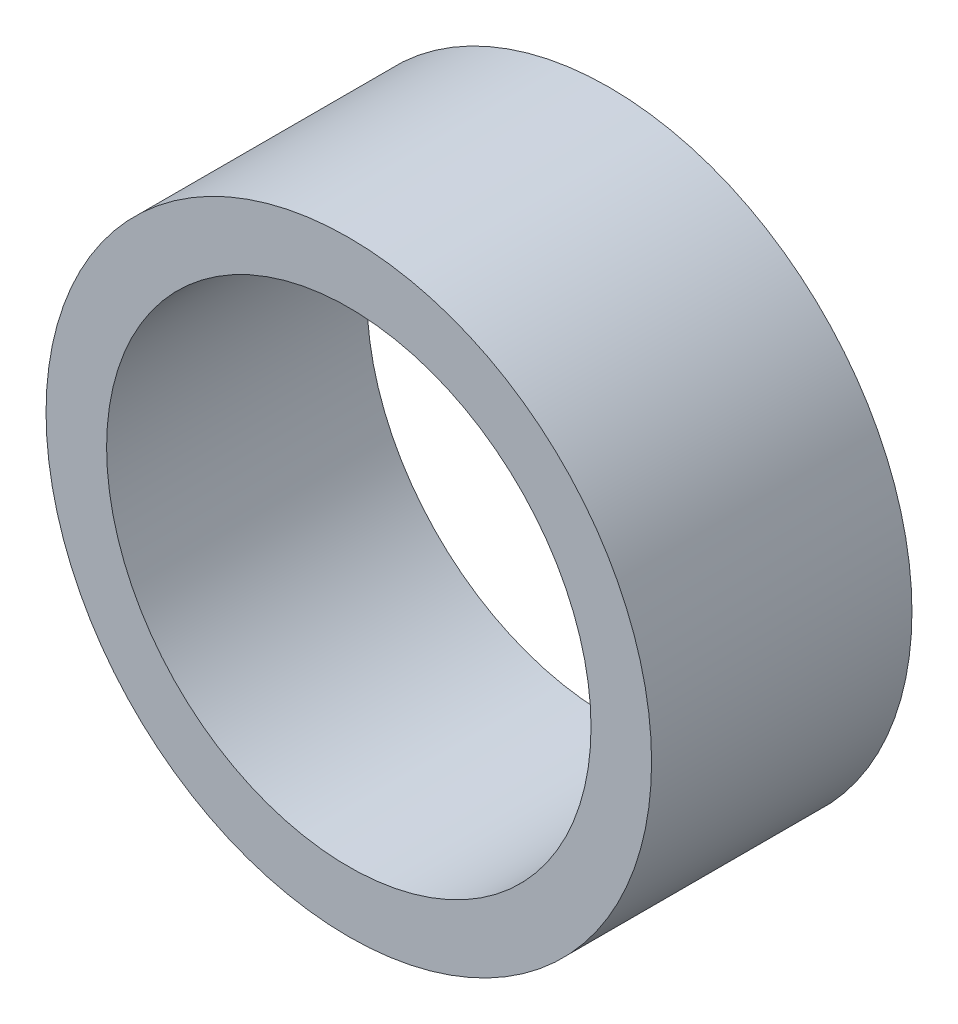
ISO-10303-21;
HEADER;
FILE_DESCRIPTION(('STEP AP214'),'2;1');
FILE_NAME('part.step','',(''),(''),'','','');
FILE_SCHEMA(('AUTOMOTIVE_DESIGN { 1 0 10303 214 1 1 1 1 }'));
ENDSEC;
DATA;
#1=APPLICATION_CONTEXT('core data for automotive mechanical design processes');
#2=APPLICATION_PROTOCOL_DEFINITION('international standard','automotive_design',2000,#1);
#3=PRODUCT_CONTEXT('',#1,'mechanical');
#4=PRODUCT('Part','Part','',(#3));
#5=PRODUCT_RELATED_PRODUCT_CATEGORY('part','',(#4));
#6=PRODUCT_DEFINITION_FORMATION('','',#4);
#7=PRODUCT_DEFINITION_CONTEXT('part definition',#1,'design');
#8=PRODUCT_DEFINITION('design','',#6,#7);
#9=PRODUCT_DEFINITION_SHAPE('','',#8);
#10=(LENGTH_UNIT() NAMED_UNIT(*) SI_UNIT(.MILLI.,.METRE.));
#11=(NAMED_UNIT(*) PLANE_ANGLE_UNIT() SI_UNIT($,.RADIAN.));
#12=(NAMED_UNIT(*) SI_UNIT($,.STERADIAN.) SOLID_ANGLE_UNIT());
#13=UNCERTAINTY_MEASURE_WITH_UNIT(LENGTH_MEASURE(1.E-05),#10,'distance_accuracy_value','');
#14=(GEOMETRIC_REPRESENTATION_CONTEXT(3) GLOBAL_UNCERTAINTY_ASSIGNED_CONTEXT((#13)) GLOBAL_UNIT_ASSIGNED_CONTEXT((#10,
#11,#12)) REPRESENTATION_CONTEXT('',''));
#15=CARTESIAN_POINT('',(0.,0.,0.));
#16=DIRECTION('',(0.,0.,1.));
#17=DIRECTION('',(1.,0.,0.));
#18=AXIS2_PLACEMENT_3D('',#15,#16,#17);
#19=CARTESIAN_POINT('',(0.,0.,10.75));
#20=DIRECTION('',(0.,0.,1.));
#21=DIRECTION('',(1.,0.,0.));
#22=AXIS2_PLACEMENT_3D('',#19,#20,#21);
#23=PLANE('',#22);
#24=CARTESIAN_POINT('',(0.,0.,10.75));
#25=DIRECTION('',(0.,0.,1.));
#26=DIRECTION('',(1.,0.,0.));
#27=AXIS2_PLACEMENT_3D('',#24,#25,#26);
#28=CIRCLE('',#27,12.5);
#29=CARTESIAN_POINT('',(12.5,0.,10.75));
#30=VERTEX_POINT('',#29);
#31=EDGE_CURVE('E10',#30,#30,#28,.T.);
#32=ORIENTED_EDGE('',*,*,#31,.T.);
#33=EDGE_LOOP('',(#32));
#34=FACE_BOUND('',#33,.T.);
#35=CARTESIAN_POINT('',(0.,0.,10.75));
#36=DIRECTION('',(0.,0.,1.));
#37=DIRECTION('',(1.,0.,0.));
#38=AXIS2_PLACEMENT_3D('',#35,#36,#37);
#39=CIRCLE('',#38,10.);
#40=CARTESIAN_POINT('',(10.,0.,10.75));
#41=VERTEX_POINT('',#40);
#42=EDGE_CURVE('E44',#41,#41,#39,.T.);
#43=ORIENTED_EDGE('',*,*,#42,.F.);
#44=EDGE_LOOP('',(#43));
#45=FACE_BOUND('',#44,.T.);
#46=ADVANCED_FACE('F33',(#34,#45),#23,.T.);
#47=CARTESIAN_POINT('',(0.,0.,0.));
#48=DIRECTION('',(0.,0.,1.));
#49=DIRECTION('',(1.,0.,0.));
#50=AXIS2_PLACEMENT_3D('',#47,#48,#49);
#51=PLANE('',#50);
#52=CARTESIAN_POINT('',(0.,0.,0.));
#53=DIRECTION('',(0.,0.,1.));
#54=DIRECTION('',(1.,0.,0.));
#55=AXIS2_PLACEMENT_3D('',#52,#53,#54);
#56=CIRCLE('',#55,12.5);
#57=CARTESIAN_POINT('',(12.5,0.,0.));
#58=VERTEX_POINT('',#57);
#59=EDGE_CURVE('E37',#58,#58,#56,.T.);
#60=ORIENTED_EDGE('',*,*,#59,.F.);
#61=EDGE_LOOP('',(#60));
#62=FACE_BOUND('',#61,.T.);
#63=CARTESIAN_POINT('',(0.,0.,0.));
#64=DIRECTION('',(0.,0.,1.));
#65=DIRECTION('',(1.,0.,0.));
#66=AXIS2_PLACEMENT_3D('',#63,#64,#65);
#67=CIRCLE('',#66,10.);
#68=CARTESIAN_POINT('',(10.,0.,0.));
#69=VERTEX_POINT('',#68);
#70=EDGE_CURVE('E46',#69,#69,#67,.T.);
#71=ORIENTED_EDGE('',*,*,#70,.T.);
#72=EDGE_LOOP('',(#71));
#73=FACE_BOUND('',#72,.T.);
#74=ADVANCED_FACE('F56',(#62,#73),#51,.F.);
#75=CARTESIAN_POINT('',(0.,0.,10.75));
#76=DIRECTION('',(0.,0.,-1.));
#77=DIRECTION('',(-1.,0.,0.));
#78=AXIS2_PLACEMENT_3D('',#75,#76,#77);
#79=CYLINDRICAL_SURFACE('',#78,12.5);
#80=ORIENTED_EDGE('',*,*,#31,.F.);
#81=EDGE_LOOP('',(#80));
#82=FACE_BOUND('',#81,.T.);
#83=ORIENTED_EDGE('',*,*,#59,.T.);
#84=EDGE_LOOP('',(#83));
#85=FACE_BOUND('',#84,.T.);
#86=ADVANCED_FACE('F35',(#82,#85),#79,.T.);
#87=CARTESIAN_POINT('',(0.,0.,10.75));
#88=DIRECTION('',(0.,0.,-1.));
#89=DIRECTION('',(-1.,0.,0.));
#90=AXIS2_PLACEMENT_3D('',#87,#88,#89);
#91=CYLINDRICAL_SURFACE('',#90,10.);
#92=ORIENTED_EDGE('',*,*,#42,.T.);
#93=EDGE_LOOP('',(#92));
#94=FACE_BOUND('',#93,.T.);
#95=ORIENTED_EDGE('',*,*,#70,.F.);
#96=EDGE_LOOP('',(#95));
#97=FACE_BOUND('',#96,.T.);
#98=ADVANCED_FACE('F52',(#94,#97),#91,.F.);
#99=CLOSED_SHELL('',(#46,#74,#86,#98));
#100=MANIFOLD_SOLID_BREP('B2',#99);
#101=ADVANCED_BREP_SHAPE_REPRESENTATION('',(#18,#100),#14);
#102=SHAPE_DEFINITION_REPRESENTATION(#9,#101);
ENDSEC;
END-ISO-10303-21;
